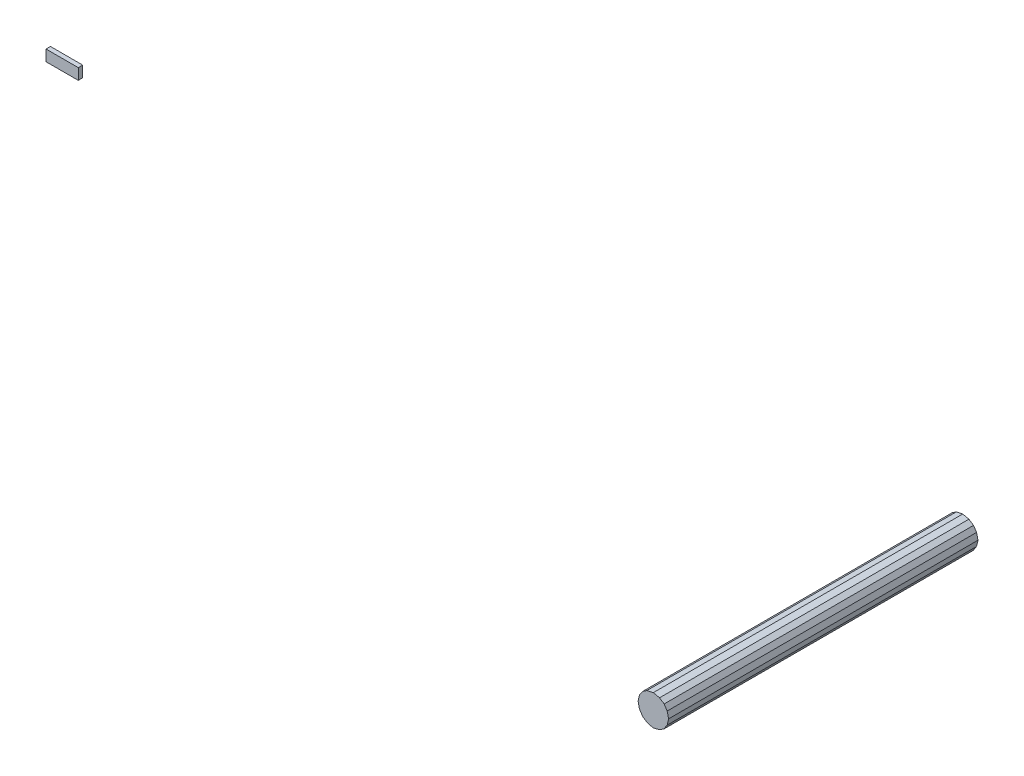
ISO-10303-21;
HEADER;
FILE_DESCRIPTION(('STEP AP214'),'2;1');
FILE_NAME('part.step','',(''),(''),'','','');
FILE_SCHEMA(('AUTOMOTIVE_DESIGN { 1 0 10303 214 1 1 1 1 }'));
ENDSEC;
DATA;
#1=APPLICATION_CONTEXT('core data for automotive mechanical design processes');
#2=APPLICATION_PROTOCOL_DEFINITION('international standard','automotive_design',2000,#1);
#3=PRODUCT_CONTEXT('',#1,'mechanical');
#4=PRODUCT('Part','Part','',(#3));
#5=PRODUCT_RELATED_PRODUCT_CATEGORY('part','',(#4));
#6=PRODUCT_DEFINITION_FORMATION('','',#4);
#7=PRODUCT_DEFINITION_CONTEXT('part definition',#1,'design');
#8=PRODUCT_DEFINITION('design','',#6,#7);
#9=PRODUCT_DEFINITION_SHAPE('','',#8);
#10=(LENGTH_UNIT() NAMED_UNIT(*) SI_UNIT(.MILLI.,.METRE.));
#11=(NAMED_UNIT(*) PLANE_ANGLE_UNIT() SI_UNIT($,.RADIAN.));
#12=(NAMED_UNIT(*) SI_UNIT($,.STERADIAN.) SOLID_ANGLE_UNIT());
#13=UNCERTAINTY_MEASURE_WITH_UNIT(LENGTH_MEASURE(1.E-05),#10,'distance_accuracy_value','');
#14=(GEOMETRIC_REPRESENTATION_CONTEXT(3) GLOBAL_UNCERTAINTY_ASSIGNED_CONTEXT((#13)) GLOBAL_UNIT_ASSIGNED_CONTEXT((#10,
#11,#12)) REPRESENTATION_CONTEXT('',''));
#15=CARTESIAN_POINT('',(0.,0.,0.));
#16=DIRECTION('',(0.,0.,1.));
#17=DIRECTION('',(1.,0.,0.));
#18=AXIS2_PLACEMENT_3D('',#15,#16,#17);
#19=CARTESIAN_POINT('',(34.573680678242,17.909886550342,9.000000650735));
#20=DIRECTION('',(0.,0.,1.));
#21=DIRECTION('',(1.,0.,0.));
#22=AXIS2_PLACEMENT_3D('',#19,#20,#21);
#23=PLANE('',#22);
#24=DIRECTION('',(-0.860789441871855,-0.508961233063914,0.));
#25=VECTOR('',#24,1.);
#26=CARTESIAN_POINT('',(34.754706478242,18.016922150342,9.000000650735));
#27=LINE('',#26,#25);
#28=CARTESIAN_POINT('',(34.754706478242,18.016922150342,9.000000650735));
#29=VERTEX_POINT('',#28);
#30=CARTESIAN_POINT('',(34.573680678242,17.909886550342,9.000000650735));
#31=VERTEX_POINT('',#30);
#32=EDGE_CURVE('P0_E26',#29,#31,#27,.T.);
#33=ORIENTED_EDGE('',*,*,#32,.F.);
#34=DIRECTION('',(-0.539246404118153,-0.842148036657239,0.));
#35=VECTOR('',#34,1.);
#36=CARTESIAN_POINT('',(34.865628278242,18.190150150342,9.000000650735));
#37=LINE('',#36,#35);
#38=CARTESIAN_POINT('',(34.865628278242,18.190150150342,9.000000650735));
#39=VERTEX_POINT('',#38);
#40=EDGE_CURVE('P0_E184',#39,#29,#37,.T.);
#41=ORIENTED_EDGE('',*,*,#40,.F.);
#42=DIRECTION('',(-0.707106781186548,-0.707106781186548,0.));
#43=VECTOR('',#42,1.);
#44=CARTESIAN_POINT('',(34.875381878242,18.199903750342,9.000000650735));
#45=LINE('',#44,#43);
#46=CARTESIAN_POINT('',(34.875381878242,18.199903750342,9.000000650735));
#47=VERTEX_POINT('',#46);
#48=EDGE_CURVE('P0_E186',#47,#39,#45,.T.);
#49=ORIENTED_EDGE('',*,*,#48,.F.);
#50=DIRECTION('',(-0.228497344288947,-0.973544536039774,0.));
#51=VECTOR('',#50,1.);
#52=CARTESIAN_POINT('',(34.927909078242,18.423703150342,9.000000650735));
#53=LINE('',#52,#51);
#54=CARTESIAN_POINT('',(34.927909078242,18.423703150342,9.000000650735));
#55=VERTEX_POINT('',#54);
#56=EDGE_CURVE('P0_E214',#55,#47,#53,.T.);
#57=ORIENTED_EDGE('',*,*,#56,.F.);
#58=DIRECTION('',(0.234264017035985,-0.972173014602938,0.));
#59=VECTOR('',#58,1.);
#60=CARTESIAN_POINT('',(34.875381878242,18.641685950342,9.000000650735));
#61=LINE('',#60,#59);
#62=CARTESIAN_POINT('',(34.875381878242,18.641685950342,9.000000650735));
#63=VERTEX_POINT('',#62);
#64=EDGE_CURVE('P0_E220',#63,#55,#61,.T.);
#65=ORIENTED_EDGE('',*,*,#64,.F.);
#66=DIRECTION('',(0.545689782249991,-0.837987268129986,0.));
#67=VECTOR('',#66,1.);
#68=CARTESIAN_POINT('',(34.766365078242,18.809097350342,9.000000650735));
#69=LINE('',#68,#67);
#70=CARTESIAN_POINT('',(34.766365078242,18.809097350342,9.000000650735));
#71=VERTEX_POINT('',#70);
#72=EDGE_CURVE('P0_E228',#71,#63,#69,.T.);
#73=ORIENTED_EDGE('',*,*,#72,.F.);
#74=DIRECTION('',(0.838007550608019,-0.545658634243012,0.));
#75=VECTOR('',#74,1.);
#76=CARTESIAN_POINT('',(34.598979078242,18.918088750342,9.000000650735));
#77=LINE('',#76,#75);
#78=CARTESIAN_POINT('',(34.598979078242,18.918088750342,9.000000650735));
#79=VERTEX_POINT('',#78);
#80=EDGE_CURVE('P0_E236',#79,#71,#77,.T.);
#81=ORIENTED_EDGE('',*,*,#80,.F.);
#82=DIRECTION('',(0.975388808551702,-0.220491886816932,0.));
#83=VECTOR('',#82,1.);
#84=CARTESIAN_POINT('',(34.375154278242,18.968685550342,9.000000650735));
#85=LINE('',#84,#83);
#86=CARTESIAN_POINT('',(34.375154278242,18.968685550342,9.000000650735));
#87=VERTEX_POINT('',#86);
#88=EDGE_CURVE('P0_E244',#87,#79,#85,.T.);
#89=ORIENTED_EDGE('',*,*,#88,.F.);
#90=DIRECTION('',(0.977328638870001,0.211727966137001,0.));
#91=VECTOR('',#90,1.);
#92=CARTESIAN_POINT('',(34.141601278242,18.918088750342,9.000000650735));
#93=LINE('',#92,#91);
#94=CARTESIAN_POINT('',(34.141601278242,18.918088750342,9.000000650735));
#95=VERTEX_POINT('',#94);
#96=EDGE_CURVE('P0_E252',#95,#87,#93,.T.);
#97=ORIENTED_EDGE('',*,*,#96,.F.);
#98=DIRECTION('',(0.825574759558204,0.564292757689139,0.));
#99=VECTOR('',#98,1.);
#100=CARTESIAN_POINT('',(33.987829678242,18.812983550342,9.000000650735));
#101=LINE('',#100,#99);
#102=CARTESIAN_POINT('',(33.987829678242,18.812983550342,9.000000650735));
#103=VERTEX_POINT('',#102);
#104=EDGE_CURVE('P0_E260',#103,#95,#101,.T.);
#105=ORIENTED_EDGE('',*,*,#104,.F.);
#106=DIRECTION('',(0.57474998902595,0.818329059800928,0.));
#107=VECTOR('',#106,1.);
#108=CARTESIAN_POINT('',(33.872996278242,18.649483750342,9.000000650735));
#109=LINE('',#108,#107);
#110=CARTESIAN_POINT('',(33.872996278242,18.649483750342,9.000000650735));
#111=VERTEX_POINT('',#110);
#112=EDGE_CURVE('P0_E268',#111,#103,#109,.T.);
#113=ORIENTED_EDGE('',*,*,#112,.F.);
#114=DIRECTION('',(0.220491886816932,0.975388808551702,0.));
#115=VECTOR('',#114,1.);
#116=CARTESIAN_POINT('',(33.822399478242,18.425658950342,9.000000650735));
#117=LINE('',#116,#115);
#118=CARTESIAN_POINT('',(33.822399478242,18.425658950342,9.000000650735));
#119=VERTEX_POINT('',#118);
#120=EDGE_CURVE('P0_E276',#119,#111,#117,.T.);
#121=ORIENTED_EDGE('',*,*,#120,.F.);
#122=DIRECTION('',(-0.220491886816932,0.975388808551702,0.));
#123=VECTOR('',#122,1.);
#124=CARTESIAN_POINT('',(33.872996278242,18.201834150342,9.000000650735));
#125=LINE('',#124,#123);
#126=CARTESIAN_POINT('',(33.872996278242,18.201834150342,9.000000650735));
#127=VERTEX_POINT('',#126);
#128=EDGE_CURVE('P0_E284',#127,#119,#125,.T.);
#129=ORIENTED_EDGE('',*,*,#128,.F.);
#130=DIRECTION('',(-0.560904658136019,0.827880404697028,0.));
#131=VECTOR('',#130,1.);
#132=CARTESIAN_POINT('',(33.995627478242,18.020833750342,9.000000650735));
#133=LINE('',#132,#131);
#134=CARTESIAN_POINT('',(33.995627478242,18.020833750342,9.000000650735));
#135=VERTEX_POINT('',#134);
#136=EDGE_CURVE('P0_E292',#135,#127,#133,.T.);
#137=ORIENTED_EDGE('',*,*,#136,.F.);
#138=DIRECTION('',(-0.836425426544044,0.548080747546029,0.));
#139=VECTOR('',#138,1.);
#140=CARTESIAN_POINT('',(34.164943878242,17.909886550342,9.000000650735));
#141=LINE('',#140,#139);
#142=CARTESIAN_POINT('',(34.164943878242,17.909886550342,9.000000650735));
#143=VERTEX_POINT('',#142);
#144=EDGE_CURVE('P0_E300',#143,#135,#141,.T.);
#145=ORIENTED_EDGE('',*,*,#144,.F.);
#146=DIRECTION('',(-0.972798430578044,0.23165321811901,0.));
#147=VECTOR('',#146,1.);
#148=CARTESIAN_POINT('',(34.369312278242,17.861220150342,9.000000650735));
#149=LINE('',#148,#147);
#150=CARTESIAN_POINT('',(34.369312278242,17.861220150342,9.000000650735));
#151=VERTEX_POINT('',#150);
#152=EDGE_CURVE('P0_E65',#151,#143,#149,.T.);
#153=ORIENTED_EDGE('',*,*,#152,.F.);
#154=DIRECTION('',(-0.972798430578044,-0.23165321811901,0.));
#155=VECTOR('',#154,1.);
#156=CARTESIAN_POINT('',(34.573680678242,17.909886550342,9.000000650735));
#157=LINE('',#156,#155);
#158=EDGE_CURVE('P0_E313',#31,#151,#157,.T.);
#159=ORIENTED_EDGE('',*,*,#158,.F.);
#160=EDGE_LOOP('',(#33,#41,#49,#57,#65,#73,#81,#89,#97,#105,#113,#121,#129,#137,#145,#153,#159));
#161=FACE_BOUND('',#160,.T.);
#162=ADVANCED_FACE('P0_F16',(#161),#23,.T.);
#163=CARTESIAN_POINT('',(34.573680678242,17.909886550342,-2.199999809265));
#164=DIRECTION('',(0.,0.,1.));
#165=DIRECTION('',(1.,0.,0.));
#166=AXIS2_PLACEMENT_3D('',#163,#164,#165);
#167=PLANE('',#166);
#168=DIRECTION('',(-0.972798430578044,-0.23165321811901,0.));
#169=VECTOR('',#168,1.);
#170=CARTESIAN_POINT('',(34.573680678242,17.909886550342,-2.199999809265));
#171=LINE('',#170,#169);
#172=CARTESIAN_POINT('',(34.573680678242,17.909886550342,-2.199999809265));
#173=VERTEX_POINT('',#172);
#174=CARTESIAN_POINT('',(34.369312278242,17.861220150342,-2.199999809265));
#175=VERTEX_POINT('',#174);
#176=EDGE_CURVE('P0_E311',#173,#175,#171,.T.);
#177=ORIENTED_EDGE('',*,*,#176,.T.);
#178=DIRECTION('',(-0.972798430578044,0.23165321811901,0.));
#179=VECTOR('',#178,1.);
#180=CARTESIAN_POINT('',(34.369312278242,17.861220150342,-2.199999809265));
#181=LINE('',#180,#179);
#182=CARTESIAN_POINT('',(34.164943878242,17.909886550342,-2.199999809265));
#183=VERTEX_POINT('',#182);
#184=EDGE_CURVE('P0_E305',#175,#183,#181,.T.);
#185=ORIENTED_EDGE('',*,*,#184,.T.);
#186=DIRECTION('',(-0.836425426544044,0.548080747546029,0.));
#187=VECTOR('',#186,1.);
#188=CARTESIAN_POINT('',(34.164943878242,17.909886550342,-2.199999809265));
#189=LINE('',#188,#187);
#190=CARTESIAN_POINT('',(33.995627478242,18.020833750342,-2.199999809265));
#191=VERTEX_POINT('',#190);
#192=EDGE_CURVE('P0_E297',#183,#191,#189,.T.);
#193=ORIENTED_EDGE('',*,*,#192,.T.);
#194=DIRECTION('',(-0.560904658136019,0.827880404697028,0.));
#195=VECTOR('',#194,1.);
#196=CARTESIAN_POINT('',(33.995627478242,18.020833750342,-2.199999809265));
#197=LINE('',#196,#195);
#198=CARTESIAN_POINT('',(33.872996278242,18.201834150342,-2.199999809265));
#199=VERTEX_POINT('',#198);
#200=EDGE_CURVE('P0_E289',#191,#199,#197,.T.);
#201=ORIENTED_EDGE('',*,*,#200,.T.);
#202=DIRECTION('',(-0.220491886816932,0.975388808551702,0.));
#203=VECTOR('',#202,1.);
#204=CARTESIAN_POINT('',(33.872996278242,18.201834150342,-2.199999809265));
#205=LINE('',#204,#203);
#206=CARTESIAN_POINT('',(33.822399478242,18.425658950342,-2.199999809265));
#207=VERTEX_POINT('',#206);
#208=EDGE_CURVE('P0_E281',#199,#207,#205,.T.);
#209=ORIENTED_EDGE('',*,*,#208,.T.);
#210=DIRECTION('',(0.220491886816932,0.975388808551702,0.));
#211=VECTOR('',#210,1.);
#212=CARTESIAN_POINT('',(33.822399478242,18.425658950342,-2.199999809265));
#213=LINE('',#212,#211);
#214=CARTESIAN_POINT('',(33.872996278242,18.649483750342,-2.199999809265));
#215=VERTEX_POINT('',#214);
#216=EDGE_CURVE('P0_E273',#207,#215,#213,.T.);
#217=ORIENTED_EDGE('',*,*,#216,.T.);
#218=DIRECTION('',(0.57474998902595,0.818329059800928,0.));
#219=VECTOR('',#218,1.);
#220=CARTESIAN_POINT('',(33.872996278242,18.649483750342,-2.199999809265));
#221=LINE('',#220,#219);
#222=CARTESIAN_POINT('',(33.987829678242,18.812983550342,-2.199999809265));
#223=VERTEX_POINT('',#222);
#224=EDGE_CURVE('P0_E265',#215,#223,#221,.T.);
#225=ORIENTED_EDGE('',*,*,#224,.T.);
#226=DIRECTION('',(0.825574759558204,0.564292757689139,0.));
#227=VECTOR('',#226,1.);
#228=CARTESIAN_POINT('',(33.987829678242,18.812983550342,-2.199999809265));
#229=LINE('',#228,#227);
#230=CARTESIAN_POINT('',(34.141601278242,18.918088750342,-2.199999809265));
#231=VERTEX_POINT('',#230);
#232=EDGE_CURVE('P0_E257',#223,#231,#229,.T.);
#233=ORIENTED_EDGE('',*,*,#232,.T.);
#234=DIRECTION('',(0.977328638870001,0.211727966137001,0.));
#235=VECTOR('',#234,1.);
#236=CARTESIAN_POINT('',(34.141601278242,18.918088750342,-2.199999809265));
#237=LINE('',#236,#235);
#238=CARTESIAN_POINT('',(34.375154278242,18.968685550342,-2.199999809265));
#239=VERTEX_POINT('',#238);
#240=EDGE_CURVE('P0_E249',#231,#239,#237,.T.);
#241=ORIENTED_EDGE('',*,*,#240,.T.);
#242=DIRECTION('',(0.975388808551702,-0.220491886816932,0.));
#243=VECTOR('',#242,1.);
#244=CARTESIAN_POINT('',(34.375154278242,18.968685550342,-2.199999809265));
#245=LINE('',#244,#243);
#246=CARTESIAN_POINT('',(34.598979078242,18.918088750342,-2.199999809265));
#247=VERTEX_POINT('',#246);
#248=EDGE_CURVE('P0_E241',#239,#247,#245,.T.);
#249=ORIENTED_EDGE('',*,*,#248,.T.);
#250=DIRECTION('',(0.838007550608019,-0.545658634243012,0.));
#251=VECTOR('',#250,1.);
#252=CARTESIAN_POINT('',(34.598979078242,18.918088750342,-2.199999809265));
#253=LINE('',#252,#251);
#254=CARTESIAN_POINT('',(34.766365078242,18.809097350342,-2.199999809265));
#255=VERTEX_POINT('',#254);
#256=EDGE_CURVE('P0_E233',#247,#255,#253,.T.);
#257=ORIENTED_EDGE('',*,*,#256,.T.);
#258=DIRECTION('',(0.545689782249991,-0.837987268129986,0.));
#259=VECTOR('',#258,1.);
#260=CARTESIAN_POINT('',(34.766365078242,18.809097350342,-2.199999809265));
#261=LINE('',#260,#259);
#262=CARTESIAN_POINT('',(34.875381878242,18.641685950342,-2.199999809265));
#263=VERTEX_POINT('',#262);
#264=EDGE_CURVE('P0_E225',#255,#263,#261,.T.);
#265=ORIENTED_EDGE('',*,*,#264,.T.);
#266=DIRECTION('',(0.234264017035985,-0.972173014602938,0.));
#267=VECTOR('',#266,1.);
#268=CARTESIAN_POINT('',(34.875381878242,18.641685950342,-2.199999809265));
#269=LINE('',#268,#267);
#270=CARTESIAN_POINT('',(34.927909078242,18.423703150342,-2.199999809265));
#271=VERTEX_POINT('',#270);
#272=EDGE_CURVE('P0_E217',#263,#271,#269,.T.);
#273=ORIENTED_EDGE('',*,*,#272,.T.);
#274=DIRECTION('',(-0.228497344288947,-0.973544536039774,0.));
#275=VECTOR('',#274,1.);
#276=CARTESIAN_POINT('',(34.927909078242,18.423703150342,-2.199999809265));
#277=LINE('',#276,#275);
#278=CARTESIAN_POINT('',(34.875381878242,18.199903750342,-2.199999809265));
#279=VERTEX_POINT('',#278);
#280=EDGE_CURVE('P0_E203',#271,#279,#277,.T.);
#281=ORIENTED_EDGE('',*,*,#280,.T.);
#282=DIRECTION('',(-0.707106781186548,-0.707106781186548,0.));
#283=VECTOR('',#282,1.);
#284=CARTESIAN_POINT('',(34.875381878242,18.199903750342,-2.199999809265));
#285=LINE('',#284,#283);
#286=CARTESIAN_POINT('',(34.865628278242,18.190150150342,-2.199999809265));
#287=VERTEX_POINT('',#286);
#288=EDGE_CURVE('P0_E190',#279,#287,#285,.T.);
#289=ORIENTED_EDGE('',*,*,#288,.T.);
#290=DIRECTION('',(-0.539246404118153,-0.842148036657239,0.));
#291=VECTOR('',#290,1.);
#292=CARTESIAN_POINT('',(34.865628278242,18.190150150342,-2.199999809265));
#293=LINE('',#292,#291);
#294=CARTESIAN_POINT('',(34.754706478242,18.016922150342,-2.199999809265));
#295=VERTEX_POINT('',#294);
#296=EDGE_CURVE('P0_E179',#287,#295,#293,.T.);
#297=ORIENTED_EDGE('',*,*,#296,.T.);
#298=DIRECTION('',(-0.860789441871855,-0.508961233063914,0.));
#299=VECTOR('',#298,1.);
#300=CARTESIAN_POINT('',(34.754706478242,18.016922150342,-2.199999809265));
#301=LINE('',#300,#299);
#302=EDGE_CURVE('P0_E11',#295,#173,#301,.T.);
#303=ORIENTED_EDGE('',*,*,#302,.T.);
#304=EDGE_LOOP('',(#177,#185,#193,#201,#209,#217,#225,#233,#241,#249,#257,#265,#273,#281,#289,
#297,#303));
#305=FACE_BOUND('',#304,.T.);
#306=ADVANCED_FACE('P0_F501',(#305),#167,.F.);
#307=CARTESIAN_POINT('',(34.754706478242,18.016922150342,-2.199999809265));
#308=DIRECTION('',(0.508961233063914,-0.860789441871855,0.));
#309=DIRECTION('',(-0.860789441871855,-0.508961233063914,0.));
#310=AXIS2_PLACEMENT_3D('',#307,#308,#309);
#311=PLANE('',#310);
#312=DIRECTION('',(0.,0.,1.));
#313=VECTOR('',#312,1.);
#314=CARTESIAN_POINT('',(34.754706478242,18.016922150342,-2.199999809265));
#315=LINE('',#314,#313);
#316=EDGE_CURVE('P0_E189',#295,#29,#315,.T.);
#317=ORIENTED_EDGE('',*,*,#316,.T.);
#318=ORIENTED_EDGE('',*,*,#32,.T.);
#319=DIRECTION('',(0.,0.,1.));
#320=VECTOR('',#319,1.);
#321=CARTESIAN_POINT('',(34.573680678242,17.909886550342,-2.199999809265));
#322=LINE('',#321,#320);
#323=EDGE_CURVE('P0_E317',#173,#31,#322,.T.);
#324=ORIENTED_EDGE('',*,*,#323,.F.);
#325=ORIENTED_EDGE('',*,*,#302,.F.);
#326=EDGE_LOOP('',(#317,#318,#324,#325));
#327=FACE_BOUND('',#326,.T.);
#328=ADVANCED_FACE('P0_F499',(#327),#311,.T.);
#329=CARTESIAN_POINT('',(34.865628278242,18.190150150342,-2.199999809265));
#330=DIRECTION('',(0.842148036657239,-0.539246404118153,0.));
#331=DIRECTION('',(-0.539246404118153,-0.842148036657239,0.));
#332=AXIS2_PLACEMENT_3D('',#329,#330,#331);
#333=PLANE('',#332);
#334=DIRECTION('',(0.,0.,1.));
#335=VECTOR('',#334,1.);
#336=CARTESIAN_POINT('',(34.865628278242,18.190150150342,-2.199999809265));
#337=LINE('',#336,#335);
#338=EDGE_CURVE('P0_E193',#287,#39,#337,.T.);
#339=ORIENTED_EDGE('',*,*,#338,.T.);
#340=ORIENTED_EDGE('',*,*,#40,.T.);
#341=ORIENTED_EDGE('',*,*,#316,.F.);
#342=ORIENTED_EDGE('',*,*,#296,.F.);
#343=EDGE_LOOP('',(#339,#340,#341,#342));
#344=FACE_BOUND('',#343,.T.);
#345=ADVANCED_FACE('P0_F194',(#344),#333,.T.);
#346=CARTESIAN_POINT('',(34.875381878242,18.199903750342,-2.199999809265));
#347=DIRECTION('',(0.707106781186548,-0.707106781186548,0.));
#348=DIRECTION('',(-0.707106781186548,-0.707106781186548,0.));
#349=AXIS2_PLACEMENT_3D('',#346,#347,#348);
#350=PLANE('',#349);
#351=DIRECTION('',(0.,0.,1.));
#352=VECTOR('',#351,1.);
#353=CARTESIAN_POINT('',(34.875381878242,18.199903750342,-2.199999809265));
#354=LINE('',#353,#352);
#355=EDGE_CURVE('P0_E200',#279,#47,#354,.T.);
#356=ORIENTED_EDGE('',*,*,#355,.T.);
#357=ORIENTED_EDGE('',*,*,#48,.T.);
#358=ORIENTED_EDGE('',*,*,#338,.F.);
#359=ORIENTED_EDGE('',*,*,#288,.F.);
#360=EDGE_LOOP('',(#356,#357,#358,#359));
#361=FACE_BOUND('',#360,.T.);
#362=ADVANCED_FACE('P0_F198',(#361),#350,.T.);
#363=CARTESIAN_POINT('',(34.927909078242,18.423703150342,-2.199999809265));
#364=DIRECTION('',(0.973544536039774,-0.228497344288947,0.));
#365=DIRECTION('',(-0.228497344288947,-0.973544536039774,0.));
#366=AXIS2_PLACEMENT_3D('',#363,#364,#365);
#367=PLANE('',#366);
#368=DIRECTION('',(0.,0.,1.));
#369=VECTOR('',#368,1.);
#370=CARTESIAN_POINT('',(34.927909078242,18.423703150342,-2.199999809265));
#371=LINE('',#370,#369);
#372=EDGE_CURVE('P0_E224',#271,#55,#371,.T.);
#373=ORIENTED_EDGE('',*,*,#372,.T.);
#374=ORIENTED_EDGE('',*,*,#56,.T.);
#375=ORIENTED_EDGE('',*,*,#355,.F.);
#376=ORIENTED_EDGE('',*,*,#280,.F.);
#377=EDGE_LOOP('',(#373,#374,#375,#376));
#378=FACE_BOUND('',#377,.T.);
#379=ADVANCED_FACE('P0_F543',(#378),#367,.T.);
#380=CARTESIAN_POINT('',(34.875381878242,18.641685950342,-2.199999809265));
#381=DIRECTION('',(0.972173014602938,0.234264017035985,0.));
#382=DIRECTION('',(0.234264017035985,-0.972173014602938,0.));
#383=AXIS2_PLACEMENT_3D('',#380,#381,#382);
#384=PLANE('',#383);
#385=DIRECTION('',(0.,0.,1.));
#386=VECTOR('',#385,1.);
#387=CARTESIAN_POINT('',(34.875381878242,18.641685950342,-2.199999809265));
#388=LINE('',#387,#386);
#389=EDGE_CURVE('P0_E232',#263,#63,#388,.T.);
#390=ORIENTED_EDGE('',*,*,#389,.T.);
#391=ORIENTED_EDGE('',*,*,#64,.T.);
#392=ORIENTED_EDGE('',*,*,#372,.F.);
#393=ORIENTED_EDGE('',*,*,#272,.F.);
#394=EDGE_LOOP('',(#390,#391,#392,#393));
#395=FACE_BOUND('',#394,.T.);
#396=ADVANCED_FACE('P0_F553',(#395),#384,.T.);
#397=CARTESIAN_POINT('',(34.766365078242,18.809097350342,-2.199999809265));
#398=DIRECTION('',(0.837987268129986,0.545689782249991,0.));
#399=DIRECTION('',(0.545689782249991,-0.837987268129986,0.));
#400=AXIS2_PLACEMENT_3D('',#397,#398,#399);
#401=PLANE('',#400);
#402=DIRECTION('',(0.,0.,1.));
#403=VECTOR('',#402,1.);
#404=CARTESIAN_POINT('',(34.766365078242,18.809097350342,-2.199999809265));
#405=LINE('',#404,#403);
#406=EDGE_CURVE('P0_E240',#255,#71,#405,.T.);
#407=ORIENTED_EDGE('',*,*,#406,.T.);
#408=ORIENTED_EDGE('',*,*,#72,.T.);
#409=ORIENTED_EDGE('',*,*,#389,.F.);
#410=ORIENTED_EDGE('',*,*,#264,.F.);
#411=EDGE_LOOP('',(#407,#408,#409,#410));
#412=FACE_BOUND('',#411,.T.);
#413=ADVANCED_FACE('P0_F564',(#412),#401,.T.);
#414=CARTESIAN_POINT('',(34.598979078242,18.918088750342,-2.199999809265));
#415=DIRECTION('',(0.545658634243012,0.838007550608019,0.));
#416=DIRECTION('',(0.838007550608019,-0.545658634243012,0.));
#417=AXIS2_PLACEMENT_3D('',#414,#415,#416);
#418=PLANE('',#417);
#419=DIRECTION('',(0.,0.,1.));
#420=VECTOR('',#419,1.);
#421=CARTESIAN_POINT('',(34.598979078242,18.918088750342,-2.199999809265));
#422=LINE('',#421,#420);
#423=EDGE_CURVE('P0_E248',#247,#79,#422,.T.);
#424=ORIENTED_EDGE('',*,*,#423,.T.);
#425=ORIENTED_EDGE('',*,*,#80,.T.);
#426=ORIENTED_EDGE('',*,*,#406,.F.);
#427=ORIENTED_EDGE('',*,*,#256,.F.);
#428=EDGE_LOOP('',(#424,#425,#426,#427));
#429=FACE_BOUND('',#428,.T.);
#430=ADVANCED_FACE('P0_F575',(#429),#418,.T.);
#431=CARTESIAN_POINT('',(34.375154278242,18.968685550342,-2.199999809265));
#432=DIRECTION('',(0.220491886816932,0.975388808551702,0.));
#433=DIRECTION('',(0.975388808551702,-0.220491886816932,0.));
#434=AXIS2_PLACEMENT_3D('',#431,#432,#433);
#435=PLANE('',#434);
#436=DIRECTION('',(0.,0.,1.));
#437=VECTOR('',#436,1.);
#438=CARTESIAN_POINT('',(34.375154278242,18.968685550342,-2.199999809265));
#439=LINE('',#438,#437);
#440=EDGE_CURVE('P0_E256',#239,#87,#439,.T.);
#441=ORIENTED_EDGE('',*,*,#440,.T.);
#442=ORIENTED_EDGE('',*,*,#88,.T.);
#443=ORIENTED_EDGE('',*,*,#423,.F.);
#444=ORIENTED_EDGE('',*,*,#248,.F.);
#445=EDGE_LOOP('',(#441,#442,#443,#444));
#446=FACE_BOUND('',#445,.T.);
#447=ADVANCED_FACE('P0_F586',(#446),#435,.T.);
#448=CARTESIAN_POINT('',(34.141601278242,18.918088750342,-2.199999809265));
#449=DIRECTION('',(-0.211727966137001,0.977328638870001,0.));
#450=DIRECTION('',(0.977328638870001,0.211727966137001,0.));
#451=AXIS2_PLACEMENT_3D('',#448,#449,#450);
#452=PLANE('',#451);
#453=DIRECTION('',(0.,0.,1.));
#454=VECTOR('',#453,1.);
#455=CARTESIAN_POINT('',(34.141601278242,18.918088750342,-2.199999809265));
#456=LINE('',#455,#454);
#457=EDGE_CURVE('P0_E264',#231,#95,#456,.T.);
#458=ORIENTED_EDGE('',*,*,#457,.T.);
#459=ORIENTED_EDGE('',*,*,#96,.T.);
#460=ORIENTED_EDGE('',*,*,#440,.F.);
#461=ORIENTED_EDGE('',*,*,#240,.F.);
#462=EDGE_LOOP('',(#458,#459,#460,#461));
#463=FACE_BOUND('',#462,.T.);
#464=ADVANCED_FACE('P0_F597',(#463),#452,.T.);
#465=CARTESIAN_POINT('',(33.987829678242,18.812983550342,-2.199999809265));
#466=DIRECTION('',(-0.564292757689139,0.825574759558204,0.));
#467=DIRECTION('',(0.825574759558204,0.564292757689139,0.));
#468=AXIS2_PLACEMENT_3D('',#465,#466,#467);
#469=PLANE('',#468);
#470=DIRECTION('',(0.,0.,1.));
#471=VECTOR('',#470,1.);
#472=CARTESIAN_POINT('',(33.987829678242,18.812983550342,-2.199999809265));
#473=LINE('',#472,#471);
#474=EDGE_CURVE('P0_E272',#223,#103,#473,.T.);
#475=ORIENTED_EDGE('',*,*,#474,.T.);
#476=ORIENTED_EDGE('',*,*,#104,.T.);
#477=ORIENTED_EDGE('',*,*,#457,.F.);
#478=ORIENTED_EDGE('',*,*,#232,.F.);
#479=EDGE_LOOP('',(#475,#476,#477,#478));
#480=FACE_BOUND('',#479,.T.);
#481=ADVANCED_FACE('P0_F608',(#480),#469,.T.);
#482=CARTESIAN_POINT('',(33.872996278242,18.649483750342,-2.199999809265));
#483=DIRECTION('',(-0.818329059800928,0.57474998902595,0.));
#484=DIRECTION('',(0.57474998902595,0.818329059800928,0.));
#485=AXIS2_PLACEMENT_3D('',#482,#483,#484);
#486=PLANE('',#485);
#487=DIRECTION('',(0.,0.,1.));
#488=VECTOR('',#487,1.);
#489=CARTESIAN_POINT('',(33.872996278242,18.649483750342,-2.199999809265));
#490=LINE('',#489,#488);
#491=EDGE_CURVE('P0_E280',#215,#111,#490,.T.);
#492=ORIENTED_EDGE('',*,*,#491,.T.);
#493=ORIENTED_EDGE('',*,*,#112,.T.);
#494=ORIENTED_EDGE('',*,*,#474,.F.);
#495=ORIENTED_EDGE('',*,*,#224,.F.);
#496=EDGE_LOOP('',(#492,#493,#494,#495));
#497=FACE_BOUND('',#496,.T.);
#498=ADVANCED_FACE('P0_F619',(#497),#486,.T.);
#499=CARTESIAN_POINT('',(33.822399478242,18.425658950342,-2.199999809265));
#500=DIRECTION('',(-0.975388808551702,0.220491886816932,0.));
#501=DIRECTION('',(0.220491886816932,0.975388808551702,0.));
#502=AXIS2_PLACEMENT_3D('',#499,#500,#501);
#503=PLANE('',#502);
#504=DIRECTION('',(0.,0.,1.));
#505=VECTOR('',#504,1.);
#506=CARTESIAN_POINT('',(33.822399478242,18.425658950342,-2.199999809265));
#507=LINE('',#506,#505);
#508=EDGE_CURVE('P0_E288',#207,#119,#507,.T.);
#509=ORIENTED_EDGE('',*,*,#508,.T.);
#510=ORIENTED_EDGE('',*,*,#120,.T.);
#511=ORIENTED_EDGE('',*,*,#491,.F.);
#512=ORIENTED_EDGE('',*,*,#216,.F.);
#513=EDGE_LOOP('',(#509,#510,#511,#512));
#514=FACE_BOUND('',#513,.T.);
#515=ADVANCED_FACE('P0_F630',(#514),#503,.T.);
#516=CARTESIAN_POINT('',(33.872996278242,18.201834150342,-2.199999809265));
#517=DIRECTION('',(-0.975388808551702,-0.220491886816932,0.));
#518=DIRECTION('',(-0.220491886816932,0.975388808551702,0.));
#519=AXIS2_PLACEMENT_3D('',#516,#517,#518);
#520=PLANE('',#519);
#521=DIRECTION('',(0.,0.,1.));
#522=VECTOR('',#521,1.);
#523=CARTESIAN_POINT('',(33.872996278242,18.201834150342,-2.199999809265));
#524=LINE('',#523,#522);
#525=EDGE_CURVE('P0_E296',#199,#127,#524,.T.);
#526=ORIENTED_EDGE('',*,*,#525,.T.);
#527=ORIENTED_EDGE('',*,*,#128,.T.);
#528=ORIENTED_EDGE('',*,*,#508,.F.);
#529=ORIENTED_EDGE('',*,*,#208,.F.);
#530=EDGE_LOOP('',(#526,#527,#528,#529));
#531=FACE_BOUND('',#530,.T.);
#532=ADVANCED_FACE('P0_F641',(#531),#520,.T.);
#533=CARTESIAN_POINT('',(33.995627478242,18.020833750342,-2.199999809265));
#534=DIRECTION('',(-0.827880404697028,-0.560904658136019,0.));
#535=DIRECTION('',(-0.560904658136019,0.827880404697028,0.));
#536=AXIS2_PLACEMENT_3D('',#533,#534,#535);
#537=PLANE('',#536);
#538=DIRECTION('',(0.,0.,1.));
#539=VECTOR('',#538,1.);
#540=CARTESIAN_POINT('',(33.995627478242,18.020833750342,-2.199999809265));
#541=LINE('',#540,#539);
#542=EDGE_CURVE('P0_E304',#191,#135,#541,.T.);
#543=ORIENTED_EDGE('',*,*,#542,.T.);
#544=ORIENTED_EDGE('',*,*,#136,.T.);
#545=ORIENTED_EDGE('',*,*,#525,.F.);
#546=ORIENTED_EDGE('',*,*,#200,.F.);
#547=EDGE_LOOP('',(#543,#544,#545,#546));
#548=FACE_BOUND('',#547,.T.);
#549=ADVANCED_FACE('P0_F652',(#548),#537,.T.);
#550=CARTESIAN_POINT('',(34.164943878242,17.909886550342,-2.199999809265));
#551=DIRECTION('',(-0.548080747546029,-0.836425426544044,0.));
#552=DIRECTION('',(-0.836425426544044,0.548080747546029,0.));
#553=AXIS2_PLACEMENT_3D('',#550,#551,#552);
#554=PLANE('',#553);
#555=DIRECTION('',(0.,0.,1.));
#556=VECTOR('',#555,1.);
#557=CARTESIAN_POINT('',(34.164943878242,17.909886550342,-2.199999809265));
#558=LINE('',#557,#556);
#559=EDGE_CURVE('P0_E310',#183,#143,#558,.T.);
#560=ORIENTED_EDGE('',*,*,#559,.T.);
#561=ORIENTED_EDGE('',*,*,#144,.T.);
#562=ORIENTED_EDGE('',*,*,#542,.F.);
#563=ORIENTED_EDGE('',*,*,#192,.F.);
#564=EDGE_LOOP('',(#560,#561,#562,#563));
#565=FACE_BOUND('',#564,.T.);
#566=ADVANCED_FACE('P0_F494',(#565),#554,.T.);
#567=CARTESIAN_POINT('',(34.369312278242,17.861220150342,-2.199999809265));
#568=DIRECTION('',(-0.23165321811901,-0.972798430578044,0.));
#569=DIRECTION('',(-0.972798430578044,0.23165321811901,0.));
#570=AXIS2_PLACEMENT_3D('',#567,#568,#569);
#571=PLANE('',#570);
#572=DIRECTION('',(0.,0.,1.));
#573=VECTOR('',#572,1.);
#574=CARTESIAN_POINT('',(34.369312278242,17.861220150342,-2.199999809265));
#575=LINE('',#574,#573);
#576=EDGE_CURVE('P0_E316',#175,#151,#575,.T.);
#577=ORIENTED_EDGE('',*,*,#576,.T.);
#578=ORIENTED_EDGE('',*,*,#152,.T.);
#579=ORIENTED_EDGE('',*,*,#559,.F.);
#580=ORIENTED_EDGE('',*,*,#184,.F.);
#581=EDGE_LOOP('',(#577,#578,#579,#580));
#582=FACE_BOUND('',#581,.T.);
#583=ADVANCED_FACE('P0_F497',(#582),#571,.T.);
#584=CARTESIAN_POINT('',(34.573680678242,17.909886550342,-2.199999809265));
#585=DIRECTION('',(0.23165321811901,-0.972798430578044,0.));
#586=DIRECTION('',(-0.972798430578044,-0.23165321811901,0.));
#587=AXIS2_PLACEMENT_3D('',#584,#585,#586);
#588=PLANE('',#587);
#589=ORIENTED_EDGE('',*,*,#323,.T.);
#590=ORIENTED_EDGE('',*,*,#158,.T.);
#591=ORIENTED_EDGE('',*,*,#576,.F.);
#592=ORIENTED_EDGE('',*,*,#176,.F.);
#593=EDGE_LOOP('',(#589,#590,#591,#592));
#594=FACE_BOUND('',#593,.T.);
#595=ADVANCED_FACE('P0_F498',(#594),#588,.T.);
#596=CLOSED_SHELL('',(#162,#306,#328,#345,#362,#379,#396,#413,#430,#447,#464,#481,#498,#515,
#532,#549,#566,#583,#595));
#597=MANIFOLD_SOLID_BREP('P0_B1',#596);
#598=CARTESIAN_POINT('',(3.54798858,18.914187259131,0.15999968));
#599=DIRECTION('',(0.,0.,-1.));
#600=DIRECTION('',(-1.,0.,0.));
#601=AXIS2_PLACEMENT_3D('',#598,#599,#600);
#602=PLANE('',#601);
#603=DIRECTION('',(1.,0.,0.));
#604=VECTOR('',#603,1.);
#605=CARTESIAN_POINT('',(3.54798858,18.914187259131,0.15999968));
#606=LINE('',#605,#604);
#607=CARTESIAN_POINT('',(3.54798858,18.914187259131,0.15999968));
#608=VERTEX_POINT('',#607);
#609=CARTESIAN_POINT('',(4.71638858,18.914187259131,0.15999968));
#610=VERTEX_POINT('',#609);
#611=EDGE_CURVE('P1_E88',#608,#610,#606,.T.);
#612=ORIENTED_EDGE('',*,*,#611,.T.);
#613=DIRECTION('',(0.,1.,0.));
#614=VECTOR('',#613,1.);
#615=CARTESIAN_POINT('',(4.71638858,18.914187259131,0.15999968));
#616=LINE('',#615,#614);
#617=CARTESIAN_POINT('',(4.71638858,19.314186459131,0.15999968));
#618=VERTEX_POINT('',#617);
#619=EDGE_CURVE('P1_E83',#610,#618,#616,.T.);
#620=ORIENTED_EDGE('',*,*,#619,.T.);
#621=DIRECTION('',(-1.,0.,0.));
#622=VECTOR('',#621,1.);
#623=CARTESIAN_POINT('',(4.71638858,19.314186459131,0.15999968));
#624=LINE('',#623,#622);
#625=CARTESIAN_POINT('',(3.54798858,19.314186459131,0.15999968));
#626=VERTEX_POINT('',#625);
#627=EDGE_CURVE('P1_E109',#618,#626,#624,.T.);
#628=ORIENTED_EDGE('',*,*,#627,.T.);
#629=DIRECTION('',(0.,-1.,0.));
#630=VECTOR('',#629,1.);
#631=CARTESIAN_POINT('',(3.54798858,19.314186459131,0.15999968));
#632=LINE('',#631,#630);
#633=EDGE_CURVE('P1_E11',#626,#608,#632,.T.);
#634=ORIENTED_EDGE('',*,*,#633,.T.);
#635=EDGE_LOOP('',(#612,#620,#628,#634));
#636=FACE_BOUND('',#635,.T.);
#637=ADVANCED_FACE('P1_F16',(#636),#602,.F.);
#638=CARTESIAN_POINT('',(3.54798858,18.914187259131,0.));
#639=DIRECTION('',(0.,0.,-1.));
#640=DIRECTION('',(-1.,0.,0.));
#641=AXIS2_PLACEMENT_3D('',#638,#639,#640);
#642=PLANE('',#641);
#643=DIRECTION('',(0.,-1.,0.));
#644=VECTOR('',#643,1.);
#645=CARTESIAN_POINT('',(3.54798858,19.314186459131,0.));
#646=LINE('',#645,#644);
#647=CARTESIAN_POINT('',(3.54798858,19.314186459131,0.));
#648=VERTEX_POINT('',#647);
#649=CARTESIAN_POINT('',(3.54798858,18.914187259131,0.));
#650=VERTEX_POINT('',#649);
#651=EDGE_CURVE('P1_E25',#648,#650,#646,.T.);
#652=ORIENTED_EDGE('',*,*,#651,.F.);
#653=DIRECTION('',(-1.,0.,0.));
#654=VECTOR('',#653,1.);
#655=CARTESIAN_POINT('',(4.71638858,19.314186459131,0.));
#656=LINE('',#655,#654);
#657=CARTESIAN_POINT('',(4.71638858,19.314186459131,0.));
#658=VERTEX_POINT('',#657);
#659=EDGE_CURVE('P1_E71',#658,#648,#656,.T.);
#660=ORIENTED_EDGE('',*,*,#659,.F.);
#661=DIRECTION('',(0.,1.,0.));
#662=VECTOR('',#661,1.);
#663=CARTESIAN_POINT('',(4.71638858,18.914187259131,0.));
#664=LINE('',#663,#662);
#665=CARTESIAN_POINT('',(4.71638858,18.914187259131,0.));
#666=VERTEX_POINT('',#665);
#667=EDGE_CURVE('P1_E65',#666,#658,#664,.T.);
#668=ORIENTED_EDGE('',*,*,#667,.F.);
#669=DIRECTION('',(1.,0.,0.));
#670=VECTOR('',#669,1.);
#671=CARTESIAN_POINT('',(3.54798858,18.914187259131,0.));
#672=LINE('',#671,#670);
#673=EDGE_CURVE('P1_E69',#650,#666,#672,.T.);
#674=ORIENTED_EDGE('',*,*,#673,.F.);
#675=EDGE_LOOP('',(#652,#660,#668,#674));
#676=FACE_BOUND('',#675,.T.);
#677=ADVANCED_FACE('P1_F67',(#676),#642,.T.);
#678=CARTESIAN_POINT('',(3.54798858,19.314186459131,0.));
#679=DIRECTION('',(1.,0.,0.));
#680=DIRECTION('',(0.,-1.,0.));
#681=AXIS2_PLACEMENT_3D('',#678,#679,#680);
#682=PLANE('',#681);
#683=ORIENTED_EDGE('',*,*,#651,.T.);
#684=DIRECTION('',(0.,0.,1.));
#685=VECTOR('',#684,1.);
#686=CARTESIAN_POINT('',(3.54798858,18.914187259131,0.));
#687=LINE('',#686,#685);
#688=EDGE_CURVE('P1_E77',#650,#608,#687,.T.);
#689=ORIENTED_EDGE('',*,*,#688,.T.);
#690=ORIENTED_EDGE('',*,*,#633,.F.);
#691=DIRECTION('',(0.,0.,1.));
#692=VECTOR('',#691,1.);
#693=CARTESIAN_POINT('',(3.54798858,19.314186459131,0.));
#694=LINE('',#693,#692);
#695=EDGE_CURVE('P1_E112',#648,#626,#694,.T.);
#696=ORIENTED_EDGE('',*,*,#695,.F.);
#697=EDGE_LOOP('',(#683,#689,#690,#696));
#698=FACE_BOUND('',#697,.T.);
#699=ADVANCED_FACE('P1_F143',(#698),#682,.F.);
#700=CARTESIAN_POINT('',(4.71638858,19.314186459131,0.));
#701=DIRECTION('',(0.,-1.,0.));
#702=DIRECTION('',(-1.,0.,0.));
#703=AXIS2_PLACEMENT_3D('',#700,#701,#702);
#704=PLANE('',#703);
#705=ORIENTED_EDGE('',*,*,#659,.T.);
#706=ORIENTED_EDGE('',*,*,#695,.T.);
#707=ORIENTED_EDGE('',*,*,#627,.F.);
#708=DIRECTION('',(0.,0.,1.));
#709=VECTOR('',#708,1.);
#710=CARTESIAN_POINT('',(4.71638858,19.314186459131,0.));
#711=LINE('',#710,#709);
#712=EDGE_CURVE('P1_E76',#658,#618,#711,.T.);
#713=ORIENTED_EDGE('',*,*,#712,.F.);
#714=EDGE_LOOP('',(#705,#706,#707,#713));
#715=FACE_BOUND('',#714,.T.);
#716=ADVANCED_FACE('P1_F142',(#715),#704,.F.);
#717=CARTESIAN_POINT('',(4.71638858,18.914187259131,0.));
#718=DIRECTION('',(-1.,0.,0.));
#719=DIRECTION('',(0.,1.,0.));
#720=AXIS2_PLACEMENT_3D('',#717,#718,#719);
#721=PLANE('',#720);
#722=ORIENTED_EDGE('',*,*,#667,.T.);
#723=ORIENTED_EDGE('',*,*,#712,.T.);
#724=ORIENTED_EDGE('',*,*,#619,.F.);
#725=DIRECTION('',(0.,0.,1.));
#726=VECTOR('',#725,1.);
#727=CARTESIAN_POINT('',(4.71638858,18.914187259131,0.));
#728=LINE('',#727,#726);
#729=EDGE_CURVE('P1_E80',#666,#610,#728,.T.);
#730=ORIENTED_EDGE('',*,*,#729,.F.);
#731=EDGE_LOOP('',(#722,#723,#724,#730));
#732=FACE_BOUND('',#731,.T.);
#733=ADVANCED_FACE('P1_F81',(#732),#721,.F.);
#734=CARTESIAN_POINT('',(3.54798858,18.914187259131,0.));
#735=DIRECTION('',(0.,1.,0.));
#736=DIRECTION('',(1.,0.,0.));
#737=AXIS2_PLACEMENT_3D('',#734,#735,#736);
#738=PLANE('',#737);
#739=ORIENTED_EDGE('',*,*,#673,.T.);
#740=ORIENTED_EDGE('',*,*,#729,.T.);
#741=ORIENTED_EDGE('',*,*,#611,.F.);
#742=ORIENTED_EDGE('',*,*,#688,.F.);
#743=EDGE_LOOP('',(#739,#740,#741,#742));
#744=FACE_BOUND('',#743,.T.);
#745=ADVANCED_FACE('P1_F91',(#744),#738,.F.);
#746=CLOSED_SHELL('',(#637,#677,#699,#716,#733,#745));
#747=MANIFOLD_SOLID_BREP('P1_B1',#746);
#748=ADVANCED_BREP_SHAPE_REPRESENTATION('',(#18,#597,#747),#14);
#749=SHAPE_DEFINITION_REPRESENTATION(#9,#748);
ENDSEC;
END-ISO-10303-21;
